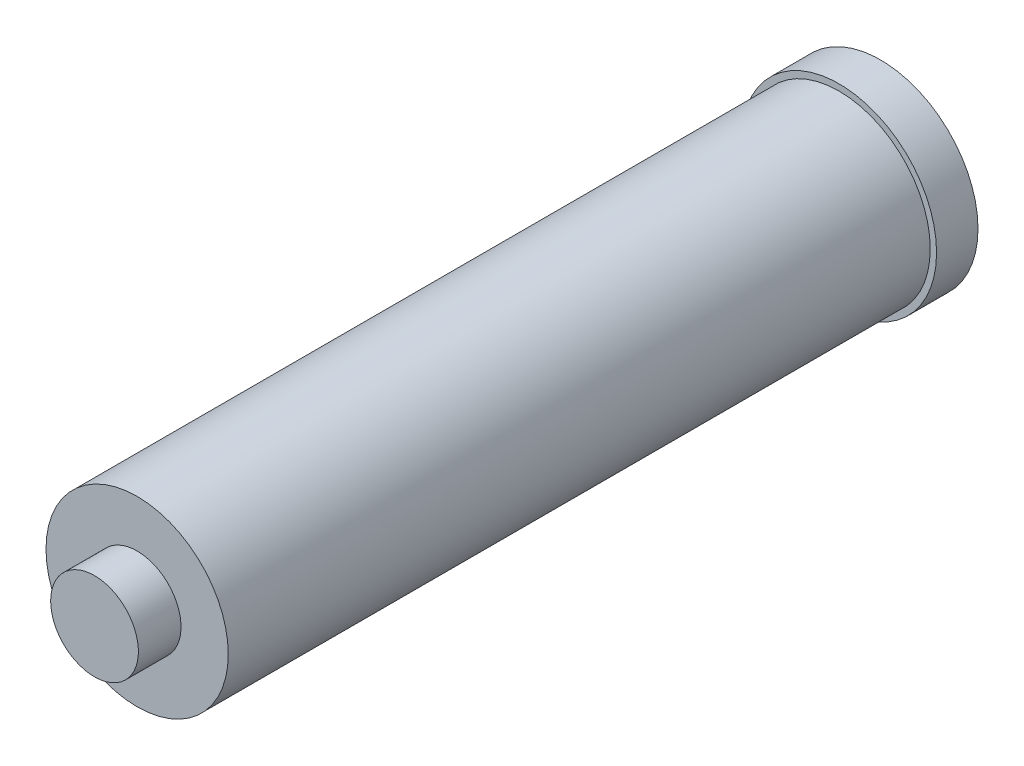
ISO-10303-21;
HEADER;
FILE_DESCRIPTION(('STEP AP214'),'2;1');
FILE_NAME('part.step','',(''),(''),'','','');
FILE_SCHEMA(('AUTOMOTIVE_DESIGN { 1 0 10303 214 1 1 1 1 }'));
ENDSEC;
DATA;
#1=APPLICATION_CONTEXT('core data for automotive mechanical design processes');
#2=APPLICATION_PROTOCOL_DEFINITION('international standard','automotive_design',2000,#1);
#3=PRODUCT_CONTEXT('',#1,'mechanical');
#4=PRODUCT('Part','Part','',(#3));
#5=PRODUCT_RELATED_PRODUCT_CATEGORY('part','',(#4));
#6=PRODUCT_DEFINITION_FORMATION('','',#4);
#7=PRODUCT_DEFINITION_CONTEXT('part definition',#1,'design');
#8=PRODUCT_DEFINITION('design','',#6,#7);
#9=PRODUCT_DEFINITION_SHAPE('','',#8);
#10=(LENGTH_UNIT() NAMED_UNIT(*) SI_UNIT(.MILLI.,.METRE.));
#11=(NAMED_UNIT(*) PLANE_ANGLE_UNIT() SI_UNIT($,.RADIAN.));
#12=(NAMED_UNIT(*) SI_UNIT($,.STERADIAN.) SOLID_ANGLE_UNIT());
#13=UNCERTAINTY_MEASURE_WITH_UNIT(LENGTH_MEASURE(1.E-05),#10,'distance_accuracy_value','');
#14=(GEOMETRIC_REPRESENTATION_CONTEXT(3) GLOBAL_UNCERTAINTY_ASSIGNED_CONTEXT((#13)) GLOBAL_UNIT_ASSIGNED_CONTEXT((#10,
#11,#12)) REPRESENTATION_CONTEXT('',''));
#15=CARTESIAN_POINT('',(0.,0.,0.));
#16=DIRECTION('',(0.,0.,1.));
#17=DIRECTION('',(1.,0.,0.));
#18=AXIS2_PLACEMENT_3D('',#15,#16,#17);
#19=CARTESIAN_POINT('',(0.,0.,146.35));
#20=DIRECTION('',(0.,0.,-1.));
#21=DIRECTION('',(-1.,0.,0.));
#22=AXIS2_PLACEMENT_3D('',#19,#20,#21);
#23=CYLINDRICAL_SURFACE('',#22,19.);
#24=CARTESIAN_POINT('',(0.,0.,146.35));
#25=DIRECTION('',(0.,0.,1.));
#26=DIRECTION('',(1.,0.,0.));
#27=AXIS2_PLACEMENT_3D('',#24,#25,#26);
#28=CIRCLE('',#27,19.);
#29=CARTESIAN_POINT('',(19.,0.,146.35));
#30=VERTEX_POINT('',#29);
#31=EDGE_CURVE('E51',#30,#30,#28,.T.);
#32=ORIENTED_EDGE('',*,*,#31,.F.);
#33=EDGE_LOOP('',(#32));
#34=FACE_BOUND('',#33,.T.);
#35=CARTESIAN_POINT('',(0.,0.,0.));
#36=DIRECTION('',(0.,0.,1.));
#37=DIRECTION('',(1.,0.,0.));
#38=AXIS2_PLACEMENT_3D('',#35,#36,#37);
#39=CIRCLE('',#38,19.);
#40=CARTESIAN_POINT('',(19.,0.,0.));
#41=VERTEX_POINT('',#40);
#42=EDGE_CURVE('E46',#41,#41,#39,.T.);
#43=ORIENTED_EDGE('',*,*,#42,.T.);
#44=EDGE_LOOP('',(#43));
#45=FACE_BOUND('',#44,.T.);
#46=ADVANCED_FACE('F43',(#34,#45),#23,.T.);
#47=CARTESIAN_POINT('',(0.,0.,146.35));
#48=DIRECTION('',(0.,0.,1.));
#49=DIRECTION('',(1.,0.,0.));
#50=AXIS2_PLACEMENT_3D('',#47,#48,#49);
#51=PLANE('',#50);
#52=CARTESIAN_POINT('',(0.,0.,146.35));
#53=DIRECTION('',(0.,0.,1.));
#54=DIRECTION('',(1.,0.,0.));
#55=AXIS2_PLACEMENT_3D('',#52,#53,#54);
#56=CIRCLE('',#55,9.144);
#57=CARTESIAN_POINT('',(-9.144,0.,146.35));
#58=VERTEX_POINT('',#57);
#59=EDGE_CURVE('E10',#58,#58,#56,.T.);
#60=ORIENTED_EDGE('',*,*,#59,.F.);
#61=EDGE_LOOP('',(#60));
#62=FACE_BOUND('',#61,.T.);
#63=ORIENTED_EDGE('',*,*,#31,.T.);
#64=EDGE_LOOP('',(#63));
#65=FACE_BOUND('',#64,.T.);
#66=ADVANCED_FACE('F90',(#62,#65),#51,.T.);
#67=CARTESIAN_POINT('',(0.,0.,-8.636));
#68=DIRECTION('',(0.,0.,1.));
#69=DIRECTION('',(1.,0.,0.));
#70=AXIS2_PLACEMENT_3D('',#67,#68,#69);
#71=CYLINDRICAL_SURFACE('',#70,20.32);
#72=CARTESIAN_POINT('',(0.,0.,-8.636));
#73=DIRECTION('',(0.,0.,-1.));
#74=DIRECTION('',(-1.,0.,0.));
#75=AXIS2_PLACEMENT_3D('',#72,#73,#74);
#76=CIRCLE('',#75,20.32);
#77=CARTESIAN_POINT('',(-20.32,0.,-8.636));
#78=VERTEX_POINT('',#77);
#79=EDGE_CURVE('E60',#78,#78,#76,.T.);
#80=ORIENTED_EDGE('',*,*,#79,.F.);
#81=EDGE_LOOP('',(#80));
#82=FACE_BOUND('',#81,.T.);
#83=CARTESIAN_POINT('',(0.,0.,0.));
#84=DIRECTION('',(0.,0.,-1.));
#85=DIRECTION('',(-1.,0.,0.));
#86=AXIS2_PLACEMENT_3D('',#83,#84,#85);
#87=CIRCLE('',#86,20.32);
#88=CARTESIAN_POINT('',(-20.32,0.,0.));
#89=VERTEX_POINT('',#88);
#90=EDGE_CURVE('E64',#89,#89,#87,.T.);
#91=ORIENTED_EDGE('',*,*,#90,.T.);
#92=EDGE_LOOP('',(#91));
#93=FACE_BOUND('',#92,.T.);
#94=ADVANCED_FACE('F95',(#82,#93),#71,.T.);
#95=CARTESIAN_POINT('',(0.,0.,-8.636));
#96=DIRECTION('',(0.,0.,-1.));
#97=DIRECTION('',(-1.,0.,0.));
#98=AXIS2_PLACEMENT_3D('',#95,#96,#97);
#99=PLANE('',#98);
#100=ORIENTED_EDGE('',*,*,#79,.T.);
#101=EDGE_LOOP('',(#100));
#102=FACE_BOUND('',#101,.T.);
#103=ADVANCED_FACE('F85',(#102),#99,.T.);
#104=CARTESIAN_POINT('',(0.,0.,0.));
#105=DIRECTION('',(0.,0.,-1.));
#106=DIRECTION('',(-1.,0.,0.));
#107=AXIS2_PLACEMENT_3D('',#104,#105,#106);
#108=PLANE('',#107);
#109=ORIENTED_EDGE('',*,*,#42,.F.);
#110=EDGE_LOOP('',(#109));
#111=FACE_BOUND('',#110,.T.);
#112=ORIENTED_EDGE('',*,*,#90,.F.);
#113=EDGE_LOOP('',(#112));
#114=FACE_BOUND('',#113,.T.);
#115=ADVANCED_FACE('F77',(#111,#114),#108,.F.);
#116=CARTESIAN_POINT('',(0.,0.,155.24));
#117=DIRECTION('',(0.,0.,-1.));
#118=DIRECTION('',(-1.,0.,0.));
#119=AXIS2_PLACEMENT_3D('',#116,#117,#118);
#120=CYLINDRICAL_SURFACE('',#119,9.144);
#121=CARTESIAN_POINT('',(0.,0.,155.24));
#122=DIRECTION('',(0.,0.,1.));
#123=DIRECTION('',(1.,0.,0.));
#124=AXIS2_PLACEMENT_3D('',#121,#122,#123);
#125=CIRCLE('',#124,9.144);
#126=CARTESIAN_POINT('',(-9.144,0.,155.24));
#127=VERTEX_POINT('',#126);
#128=EDGE_CURVE('E59',#127,#127,#125,.T.);
#129=CARTESIAN_POINT('',(-9.144,0.,155.24));
#130=CARTESIAN_POINT('',(-9.144,0.,155.147395833333));
#131=CARTESIAN_POINT('',(-9.144,0.,155.054791666667));
#132=CARTESIAN_POINT('',(-9.144,0.,154.869583333333));
#133=CARTESIAN_POINT('',(-9.144,0.,154.776979166667));
#134=CARTESIAN_POINT('',(-9.144,0.,154.591770833333));
#135=CARTESIAN_POINT('',(-9.144,0.,154.499166666667));
#136=CARTESIAN_POINT('',(-9.144,0.,154.313958333333));
#137=CARTESIAN_POINT('',(-9.144,0.,154.221354166667));
#138=CARTESIAN_POINT('',(-9.144,0.,154.036145833333));
#139=CARTESIAN_POINT('',(-9.144,0.,153.943541666667));
#140=CARTESIAN_POINT('',(-9.144,0.,153.758333333333));
#141=CARTESIAN_POINT('',(-9.144,0.,153.665729166667));
#142=CARTESIAN_POINT('',(-9.144,0.,153.480520833333));
#143=CARTESIAN_POINT('',(-9.144,0.,153.387916666667));
#144=CARTESIAN_POINT('',(-9.144,0.,153.202708333333));
#145=CARTESIAN_POINT('',(-9.144,0.,153.110104166667));
#146=CARTESIAN_POINT('',(-9.144,0.,152.924895833333));
#147=CARTESIAN_POINT('',(-9.144,0.,152.832291666667));
#148=CARTESIAN_POINT('',(-9.144,0.,152.647083333333));
#149=CARTESIAN_POINT('',(-9.144,0.,152.554479166667));
#150=CARTESIAN_POINT('',(-9.144,0.,152.369270833333));
#151=CARTESIAN_POINT('',(-9.144,0.,152.276666666667));
#152=CARTESIAN_POINT('',(-9.144,0.,152.091458333333));
#153=CARTESIAN_POINT('',(-9.144,0.,151.998854166667));
#154=CARTESIAN_POINT('',(-9.144,0.,151.813645833333));
#155=CARTESIAN_POINT('',(-9.144,0.,151.721041666667));
#156=CARTESIAN_POINT('',(-9.144,0.,151.535833333333));
#157=CARTESIAN_POINT('',(-9.144,0.,151.443229166667));
#158=CARTESIAN_POINT('',(-9.144,0.,151.258020833333));
#159=CARTESIAN_POINT('',(-9.144,0.,151.165416666667));
#160=CARTESIAN_POINT('',(-9.144,0.,150.980208333333));
#161=CARTESIAN_POINT('',(-9.144,0.,150.887604166667));
#162=CARTESIAN_POINT('',(-9.144,0.,150.702395833333));
#163=CARTESIAN_POINT('',(-9.144,0.,150.609791666667));
#164=CARTESIAN_POINT('',(-9.144,0.,150.424583333333));
#165=CARTESIAN_POINT('',(-9.144,0.,150.331979166667));
#166=CARTESIAN_POINT('',(-9.144,0.,150.146770833333));
#167=CARTESIAN_POINT('',(-9.144,0.,150.054166666667));
#168=CARTESIAN_POINT('',(-9.144,0.,149.868958333333));
#169=CARTESIAN_POINT('',(-9.144,0.,149.776354166667));
#170=CARTESIAN_POINT('',(-9.144,0.,149.591145833333));
#171=CARTESIAN_POINT('',(-9.144,0.,149.498541666667));
#172=CARTESIAN_POINT('',(-9.144,0.,149.313333333333));
#173=CARTESIAN_POINT('',(-9.144,0.,149.220729166667));
#174=CARTESIAN_POINT('',(-9.144,0.,149.035520833333));
#175=CARTESIAN_POINT('',(-9.144,0.,148.942916666667));
#176=CARTESIAN_POINT('',(-9.144,0.,148.757708333333));
#177=CARTESIAN_POINT('',(-9.144,0.,148.665104166667));
#178=CARTESIAN_POINT('',(-9.144,0.,148.479895833333));
#179=CARTESIAN_POINT('',(-9.144,0.,148.387291666667));
#180=CARTESIAN_POINT('',(-9.144,0.,148.202083333333));
#181=CARTESIAN_POINT('',(-9.144,0.,148.109479166667));
#182=CARTESIAN_POINT('',(-9.144,0.,147.924270833333));
#183=CARTESIAN_POINT('',(-9.144,0.,147.831666666667));
#184=CARTESIAN_POINT('',(-9.144,0.,147.646458333333));
#185=CARTESIAN_POINT('',(-9.144,0.,147.553854166667));
#186=CARTESIAN_POINT('',(-9.144,0.,147.368645833333));
#187=CARTESIAN_POINT('',(-9.144,0.,147.276041666667));
#188=CARTESIAN_POINT('',(-9.144,0.,147.090833333333));
#189=CARTESIAN_POINT('',(-9.144,0.,146.998229166667));
#190=CARTESIAN_POINT('',(-9.144,0.,146.813020833333));
#191=CARTESIAN_POINT('',(-9.144,0.,146.720416666667));
#192=CARTESIAN_POINT('',(-9.144,0.,146.535208333333));
#193=CARTESIAN_POINT('',(-9.144,0.,146.442604166667));
#194=CARTESIAN_POINT('',(-9.144,0.,146.35));
#195=B_SPLINE_CURVE_WITH_KNOTS('',3,(#129,#130,#131,#132,#133,#134,#135,#136,#137,#138,#139,
#140,#141,#142,#143,#144,#145,#146,#147,#148,#149,#150,#151,#152,#153,#154,#155,#156,#157,#158,
#159,#160,#161,#162,#163,#164,#165,#166,#167,#168,#169,#170,#171,#172,#173,#174,#175,#176,#177,
#178,#179,#180,#181,#182,#183,#184,#185,#186,#187,#188,#189,#190,#191,#192,#193,#194),
.UNSPECIFIED.,.F.,.F.,(4,2,2,2,2,2,2,2,2,2,2,2,2,2,2,2,2,2,2,2,2,2,2,2,2,2,2,2,2,2,2,2,4),(0.,
0.277812499999974,0.555624999999976,0.833437499999978,1.11124999999998,1.38906249999998,
1.66687499999998,1.94468749999999,2.22249999999999,2.50031249999999,2.77812499999999,
3.05593749999999,3.33375,3.6115625,3.889375,4.1671875,4.44499999999998,4.72281249999998,
5.00062499999998,5.27843749999998,5.55624999999998,5.83406249999999,6.11187499999999,
6.38968749999999,6.66749999999999,6.94531249999999,7.223125,7.5009375,7.77875,8.0565625,
8.334375,8.61218749999998,8.88999999999998),.UNSPECIFIED.);
#196=EDGE_CURVE('BSEAM75',#127,#58,#195,.T.);
#197=ORIENTED_EDGE('',*,*,#128,.F.);
#198=ORIENTED_EDGE('',*,*,#59,.T.);
#199=ORIENTED_EDGE('',*,*,#196,.T.);
#200=ORIENTED_EDGE('',*,*,#196,.F.);
#201=EDGE_LOOP('',(#197,#199,#198,#200));
#202=FACE_BOUND('',#201,.T.);
#203=ADVANCED_FACE('F75',(#202),#120,.T.);
#204=CARTESIAN_POINT('',(0.,0.,155.24));
#205=DIRECTION('',(0.,0.,1.));
#206=DIRECTION('',(1.,0.,0.));
#207=AXIS2_PLACEMENT_3D('',#204,#205,#206);
#208=PLANE('',#207);
#209=ORIENTED_EDGE('',*,*,#128,.T.);
#210=EDGE_LOOP('',(#209));
#211=FACE_BOUND('',#210,.T.);
#212=ADVANCED_FACE('F73',(#211),#208,.T.);
#213=CLOSED_SHELL('',(#46,#66,#94,#103,#115,#203,#212));
#214=MANIFOLD_SOLID_BREP('B2',#213);
#215=ADVANCED_BREP_SHAPE_REPRESENTATION('',(#18,#214),#14);
#216=SHAPE_DEFINITION_REPRESENTATION(#9,#215);
ENDSEC;
END-ISO-10303-21;
